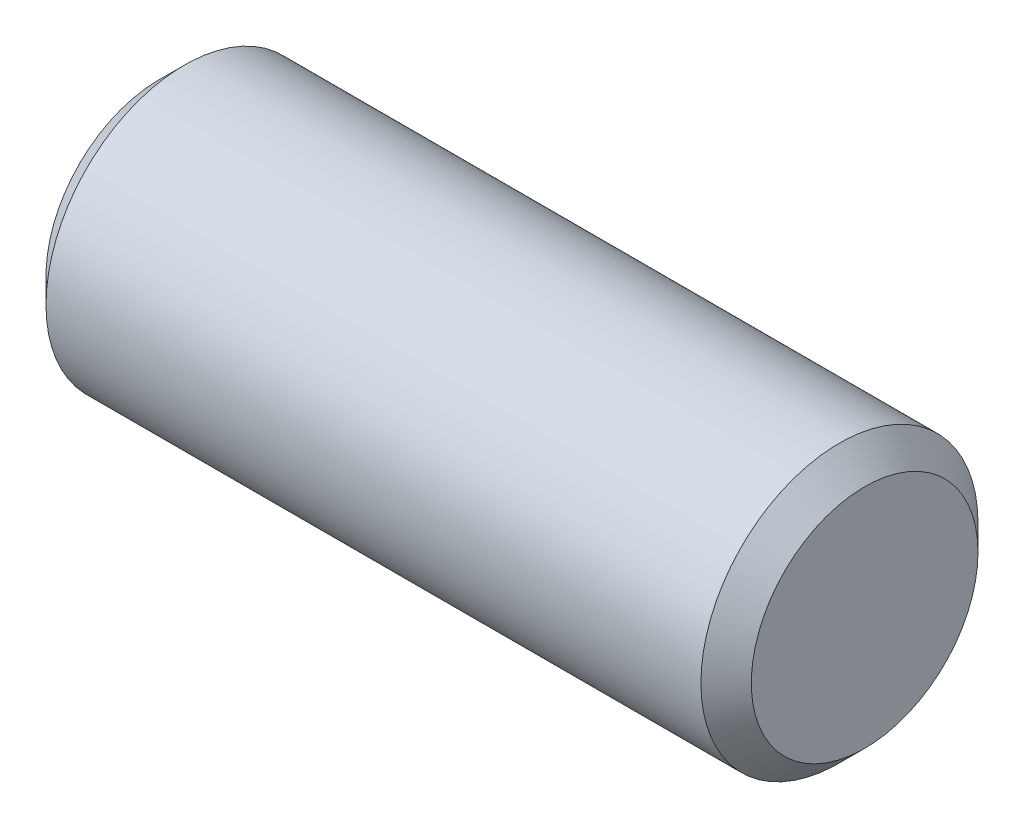
ISO-10303-21;
HEADER;
FILE_DESCRIPTION(('STEP AP214'),'2;1');
FILE_NAME('part.step','',(''),(''),'','','');
FILE_SCHEMA(('AUTOMOTIVE_DESIGN { 1 0 10303 214 1 1 1 1 }'));
ENDSEC;
DATA;
#1=APPLICATION_CONTEXT('core data for automotive mechanical design processes');
#2=APPLICATION_PROTOCOL_DEFINITION('international standard','automotive_design',2000,#1);
#3=PRODUCT_CONTEXT('',#1,'mechanical');
#4=PRODUCT('Part','Part','',(#3));
#5=PRODUCT_RELATED_PRODUCT_CATEGORY('part','',(#4));
#6=PRODUCT_DEFINITION_FORMATION('','',#4);
#7=PRODUCT_DEFINITION_CONTEXT('part definition',#1,'design');
#8=PRODUCT_DEFINITION('design','',#6,#7);
#9=PRODUCT_DEFINITION_SHAPE('','',#8);
#10=(LENGTH_UNIT() NAMED_UNIT(*) SI_UNIT(.MILLI.,.METRE.));
#11=(NAMED_UNIT(*) PLANE_ANGLE_UNIT() SI_UNIT($,.RADIAN.));
#12=(NAMED_UNIT(*) SI_UNIT($,.STERADIAN.) SOLID_ANGLE_UNIT());
#13=UNCERTAINTY_MEASURE_WITH_UNIT(LENGTH_MEASURE(1.E-05),#10,'distance_accuracy_value','');
#14=(GEOMETRIC_REPRESENTATION_CONTEXT(3) GLOBAL_UNCERTAINTY_ASSIGNED_CONTEXT((#13)) GLOBAL_UNIT_ASSIGNED_CONTEXT((#10,
#11,#12)) REPRESENTATION_CONTEXT('',''));
#15=CARTESIAN_POINT('',(0.,0.,0.));
#16=DIRECTION('',(0.,0.,1.));
#17=DIRECTION('',(1.,0.,0.));
#18=AXIS2_PLACEMENT_3D('',#15,#16,#17);
#19=CARTESIAN_POINT('',(0.,0.,0.));
#20=DIRECTION('',(1.,0.,0.));
#21=DIRECTION('',(0.,0.,-1.));
#22=AXIS2_PLACEMENT_3D('',#19,#20,#21);
#23=PLANE('',#22);
#24=CARTESIAN_POINT('',(0.,0.,0.));
#25=DIRECTION('',(1.,0.,0.));
#26=DIRECTION('',(0.,0.,-1.));
#27=AXIS2_PLACEMENT_3D('',#24,#25,#26);
#28=CIRCLE('',#27,9.);
#29=CARTESIAN_POINT('',(0.,0.,-9.));
#30=VERTEX_POINT('',#29);
#31=EDGE_CURVE('E10',#30,#30,#28,.T.);
#32=ORIENTED_EDGE('',*,*,#31,.T.);
#33=EDGE_LOOP('',(#32));
#34=FACE_BOUND('',#33,.T.);
#35=ADVANCED_FACE('F30',(#34),#23,.T.);
#36=CARTESIAN_POINT('',(0.,0.,0.));
#37=DIRECTION('',(-1.,0.,0.));
#38=DIRECTION('',(0.,0.,1.));
#39=AXIS2_PLACEMENT_3D('',#36,#37,#38);
#40=CONICAL_SURFACE('',#39,9.,0.78539816339745);
#41=CARTESIAN_POINT('',(-1.99999999999999,0.,0.));
#42=DIRECTION('',(1.,0.,0.));
#43=DIRECTION('',(0.,0.,-1.));
#44=AXIS2_PLACEMENT_3D('',#41,#42,#43);
#45=CIRCLE('',#44,11.);
#46=CARTESIAN_POINT('',(-1.99999999999999,0.,-11.));
#47=VERTEX_POINT('',#46);
#48=EDGE_CURVE('E36',#47,#47,#45,.T.);
#49=ORIENTED_EDGE('',*,*,#48,.T.);
#50=EDGE_LOOP('',(#49));
#51=FACE_BOUND('',#50,.T.);
#52=ORIENTED_EDGE('',*,*,#31,.F.);
#53=EDGE_LOOP('',(#52));
#54=FACE_BOUND('',#53,.T.);
#55=ADVANCED_FACE('F62',(#51,#54),#40,.T.);
#56=CARTESIAN_POINT('',(0.,0.,0.));
#57=DIRECTION('',(1.,0.,0.));
#58=DIRECTION('',(0.,0.,-1.));
#59=AXIS2_PLACEMENT_3D('',#56,#57,#58);
#60=CYLINDRICAL_SURFACE('',#59,11.);
#61=CARTESIAN_POINT('',(-54.,0.,0.));
#62=DIRECTION('',(1.,0.,0.));
#63=DIRECTION('',(0.,0.,-1.));
#64=AXIS2_PLACEMENT_3D('',#61,#62,#63);
#65=CIRCLE('',#64,11.);
#66=CARTESIAN_POINT('',(-54.,0.,-11.));
#67=VERTEX_POINT('',#66);
#68=EDGE_CURVE('E40',#67,#67,#65,.T.);
#69=ORIENTED_EDGE('',*,*,#68,.T.);
#70=EDGE_LOOP('',(#69));
#71=FACE_BOUND('',#70,.T.);
#72=ORIENTED_EDGE('',*,*,#48,.F.);
#73=EDGE_LOOP('',(#72));
#74=FACE_BOUND('',#73,.T.);
#75=ADVANCED_FACE('F59',(#71,#74),#60,.T.);
#76=CARTESIAN_POINT('',(-54.,0.,0.));
#77=DIRECTION('',(1.,0.,0.));
#78=DIRECTION('',(0.,0.,-1.));
#79=AXIS2_PLACEMENT_3D('',#76,#77,#78);
#80=CONICAL_SURFACE('',#79,11.,0.785398163397448);
#81=CARTESIAN_POINT('',(-56.,0.,0.));
#82=DIRECTION('',(1.,0.,0.));
#83=DIRECTION('',(0.,0.,-1.));
#84=AXIS2_PLACEMENT_3D('',#81,#82,#83);
#85=CIRCLE('',#84,8.99999999999999);
#86=CARTESIAN_POINT('',(-56.,0.,-8.99999999999999));
#87=VERTEX_POINT('',#86);
#88=EDGE_CURVE('E44',#87,#87,#85,.T.);
#89=ORIENTED_EDGE('',*,*,#88,.T.);
#90=EDGE_LOOP('',(#89));
#91=FACE_BOUND('',#90,.T.);
#92=ORIENTED_EDGE('',*,*,#68,.F.);
#93=EDGE_LOOP('',(#92));
#94=FACE_BOUND('',#93,.T.);
#95=ADVANCED_FACE('F50',(#91,#94),#80,.T.);
#96=CARTESIAN_POINT('',(-56.,8.99999999999999,0.));
#97=DIRECTION('',(-1.,0.,0.));
#98=DIRECTION('',(0.,0.,1.));
#99=AXIS2_PLACEMENT_3D('',#96,#97,#98);
#100=PLANE('',#99);
#101=ORIENTED_EDGE('',*,*,#88,.F.);
#102=EDGE_LOOP('',(#101));
#103=FACE_BOUND('',#102,.T.);
#104=ADVANCED_FACE('F53',(#103),#100,.T.);
#105=CLOSED_SHELL('',(#35,#55,#75,#95,#104));
#106=MANIFOLD_SOLID_BREP('B2',#105);
#107=ADVANCED_BREP_SHAPE_REPRESENTATION('',(#18,#106),#14);
#108=SHAPE_DEFINITION_REPRESENTATION(#9,#107);
ENDSEC;
END-ISO-10303-21;
